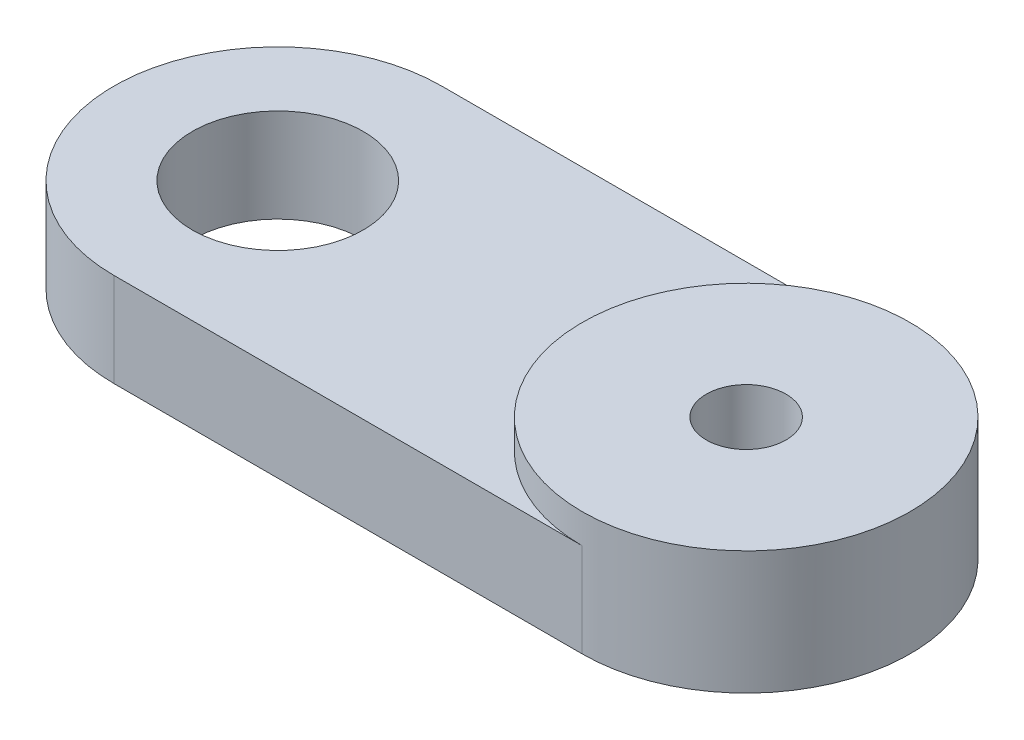
ISO-10303-21;
HEADER;
FILE_DESCRIPTION(('STEP AP214'),'2;1');
FILE_NAME('part.step','',(''),(''),'','','');
FILE_SCHEMA(('AUTOMOTIVE_DESIGN { 1 0 10303 214 1 1 1 1 }'));
ENDSEC;
DATA;
#1=APPLICATION_CONTEXT('core data for automotive mechanical design processes');
#2=APPLICATION_PROTOCOL_DEFINITION('international standard','automotive_design',2000,#1);
#3=PRODUCT_CONTEXT('',#1,'mechanical');
#4=PRODUCT('Part','Part','',(#3));
#5=PRODUCT_RELATED_PRODUCT_CATEGORY('part','',(#4));
#6=PRODUCT_DEFINITION_FORMATION('','',#4);
#7=PRODUCT_DEFINITION_CONTEXT('part definition',#1,'design');
#8=PRODUCT_DEFINITION('design','',#6,#7);
#9=PRODUCT_DEFINITION_SHAPE('','',#8);
#10=(LENGTH_UNIT() NAMED_UNIT(*) SI_UNIT(.MILLI.,.METRE.));
#11=(NAMED_UNIT(*) PLANE_ANGLE_UNIT() SI_UNIT($,.RADIAN.));
#12=(NAMED_UNIT(*) SI_UNIT($,.STERADIAN.) SOLID_ANGLE_UNIT());
#13=UNCERTAINTY_MEASURE_WITH_UNIT(LENGTH_MEASURE(1.E-05),#10,'distance_accuracy_value','');
#14=(GEOMETRIC_REPRESENTATION_CONTEXT(3) GLOBAL_UNCERTAINTY_ASSIGNED_CONTEXT((#13)) GLOBAL_UNIT_ASSIGNED_CONTEXT((#10,
#11,#12)) REPRESENTATION_CONTEXT('',''));
#15=CARTESIAN_POINT('',(0.,0.,0.));
#16=DIRECTION('',(0.,0.,1.));
#17=DIRECTION('',(1.,0.,0.));
#18=AXIS2_PLACEMENT_3D('',#15,#16,#17);
#19=CARTESIAN_POINT('',(12.7,2.54,0.));
#20=DIRECTION('',(0.,-1.,0.));
#21=DIRECTION('',(0.,0.,-1.));
#22=AXIS2_PLACEMENT_3D('',#19,#20,#21);
#23=CYLINDRICAL_SURFACE('',#22,4.445);
#24=CARTESIAN_POINT('',(12.7,0.,0.));
#25=DIRECTION('',(0.,1.,0.));
#26=DIRECTION('',(0.,0.,1.));
#27=AXIS2_PLACEMENT_3D('',#24,#25,#26);
#28=CIRCLE('',#27,4.445);
#29=CARTESIAN_POINT('',(12.7,0.,4.445));
#30=VERTEX_POINT('',#29);
#31=CARTESIAN_POINT('',(12.7,0.,-4.445));
#32=VERTEX_POINT('',#31);
#33=EDGE_CURVE('E97',#30,#32,#28,.T.);
#34=ORIENTED_EDGE('',*,*,#33,.T.);
#35=DIRECTION('',(0.,-1.,0.));
#36=VECTOR('',#35,1.);
#37=CARTESIAN_POINT('',(12.7,2.54,-4.445));
#38=LINE('',#37,#36);
#39=CARTESIAN_POINT('',(12.7,2.54,-4.445));
#40=VERTEX_POINT('',#39);
#41=EDGE_CURVE('E40',#40,#32,#38,.T.);
#42=ORIENTED_EDGE('',*,*,#41,.F.);
#43=CARTESIAN_POINT('',(12.7,2.54,0.));
#44=DIRECTION('',(0.,1.,0.));
#45=DIRECTION('',(0.,0.,1.));
#46=AXIS2_PLACEMENT_3D('',#43,#44,#45);
#47=CIRCLE('',#46,4.445);
#48=CARTESIAN_POINT('',(12.7,2.54,4.445));
#49=VERTEX_POINT('',#48);
#50=EDGE_CURVE('E12',#40,#49,#47,.T.);
#51=ORIENTED_EDGE('',*,*,#50,.T.);
#52=DIRECTION('',(0.,-1.,0.));
#53=VECTOR('',#52,1.);
#54=CARTESIAN_POINT('',(12.7,2.54,4.445));
#55=LINE('',#54,#53);
#56=EDGE_CURVE('E83',#49,#30,#55,.T.);
#57=ORIENTED_EDGE('',*,*,#56,.T.);
#58=EDGE_LOOP('',(#34,#42,#51,#57));
#59=FACE_BOUND('',#58,.T.);
#60=CARTESIAN_POINT('',(12.7,3.34,0.));
#61=DIRECTION('',(0.,1.,0.));
#62=DIRECTION('',(0.,0.,1.));
#63=AXIS2_PLACEMENT_3D('',#60,#61,#62);
#64=CIRCLE('',#63,4.445);
#65=CARTESIAN_POINT('',(12.7,3.34,4.445));
#66=VERTEX_POINT('',#65);
#67=EDGE_CURVE('E115',#66,#66,#64,.T.);
#68=ORIENTED_EDGE('',*,*,#67,.F.);
#69=EDGE_LOOP('',(#68));
#70=FACE_BOUND('',#69,.T.);
#71=ADVANCED_FACE('F37',(#59,#70),#23,.T.);
#72=CARTESIAN_POINT('',(0.,2.54,-4.445));
#73=DIRECTION('',(0.,0.,-1.));
#74=DIRECTION('',(-1.,0.,0.));
#75=AXIS2_PLACEMENT_3D('',#72,#73,#74);
#76=PLANE('',#75);
#77=DIRECTION('',(1.,0.,0.));
#78=VECTOR('',#77,1.);
#79=CARTESIAN_POINT('',(0.,0.,-4.445));
#80=LINE('',#79,#78);
#81=CARTESIAN_POINT('',(0.,0.,-4.445));
#82=VERTEX_POINT('',#81);
#83=EDGE_CURVE('E114',#82,#32,#80,.T.);
#84=ORIENTED_EDGE('',*,*,#83,.F.);
#85=DIRECTION('',(0.,-1.,0.));
#86=VECTOR('',#85,1.);
#87=CARTESIAN_POINT('',(0.,2.54,-4.445));
#88=LINE('',#87,#86);
#89=CARTESIAN_POINT('',(0.,2.54,-4.445));
#90=VERTEX_POINT('',#89);
#91=EDGE_CURVE('E101',#90,#82,#88,.T.);
#92=ORIENTED_EDGE('',*,*,#91,.F.);
#93=DIRECTION('',(1.,0.,0.));
#94=VECTOR('',#93,1.);
#95=CARTESIAN_POINT('',(0.,2.54,-4.445));
#96=LINE('',#95,#94);
#97=EDGE_CURVE('E102',#90,#40,#96,.T.);
#98=ORIENTED_EDGE('',*,*,#97,.T.);
#99=ORIENTED_EDGE('',*,*,#41,.T.);
#100=EDGE_LOOP('',(#84,#92,#98,#99));
#101=FACE_BOUND('',#100,.T.);
#102=ADVANCED_FACE('F103',(#101),#76,.T.);
#103=CARTESIAN_POINT('',(0.,2.54,0.));
#104=DIRECTION('',(0.,-1.,0.));
#105=DIRECTION('',(0.,0.,-1.));
#106=AXIS2_PLACEMENT_3D('',#103,#104,#105);
#107=CYLINDRICAL_SURFACE('',#106,4.445);
#108=CARTESIAN_POINT('',(0.,0.,0.));
#109=DIRECTION('',(0.,1.,0.));
#110=DIRECTION('',(0.,0.,1.));
#111=AXIS2_PLACEMENT_3D('',#108,#109,#110);
#112=CIRCLE('',#111,4.445);
#113=CARTESIAN_POINT('',(0.,0.,4.445));
#114=VERTEX_POINT('',#113);
#115=EDGE_CURVE('E71',#82,#114,#112,.T.);
#116=ORIENTED_EDGE('',*,*,#115,.T.);
#117=DIRECTION('',(0.,-1.,0.));
#118=VECTOR('',#117,1.);
#119=CARTESIAN_POINT('',(0.,2.54,4.445));
#120=LINE('',#119,#118);
#121=CARTESIAN_POINT('',(0.,2.54,4.445));
#122=VERTEX_POINT('',#121);
#123=EDGE_CURVE('E89',#122,#114,#120,.T.);
#124=ORIENTED_EDGE('',*,*,#123,.F.);
#125=CARTESIAN_POINT('',(0.,2.54,0.));
#126=DIRECTION('',(0.,1.,0.));
#127=DIRECTION('',(0.,0.,1.));
#128=AXIS2_PLACEMENT_3D('',#125,#126,#127);
#129=CIRCLE('',#128,4.445);
#130=EDGE_CURVE('E54',#90,#122,#129,.T.);
#131=ORIENTED_EDGE('',*,*,#130,.F.);
#132=ORIENTED_EDGE('',*,*,#91,.T.);
#133=EDGE_LOOP('',(#116,#124,#131,#132));
#134=FACE_BOUND('',#133,.T.);
#135=ADVANCED_FACE('F119',(#134),#107,.T.);
#136=CARTESIAN_POINT('',(0.,2.54,0.));
#137=DIRECTION('',(0.,-1.,0.));
#138=DIRECTION('',(0.,0.,-1.));
#139=AXIS2_PLACEMENT_3D('',#136,#137,#138);
#140=CYLINDRICAL_SURFACE('',#139,2.31775);
#141=CARTESIAN_POINT('',(0.,2.54,0.));
#142=DIRECTION('',(0.,1.,0.));
#143=DIRECTION('',(0.,0.,1.));
#144=AXIS2_PLACEMENT_3D('',#141,#142,#143);
#145=CIRCLE('',#144,2.31775);
#146=CARTESIAN_POINT('',(0.,2.54,2.31775));
#147=VERTEX_POINT('',#146);
#148=EDGE_CURVE('E90',#147,#147,#145,.T.);
#149=ORIENTED_EDGE('',*,*,#148,.T.);
#150=EDGE_LOOP('',(#149));
#151=FACE_BOUND('',#150,.T.);
#152=CARTESIAN_POINT('',(0.,0.,0.));
#153=DIRECTION('',(0.,1.,0.));
#154=DIRECTION('',(0.,0.,1.));
#155=AXIS2_PLACEMENT_3D('',#152,#153,#154);
#156=CIRCLE('',#155,2.31775);
#157=CARTESIAN_POINT('',(0.,0.,2.31775));
#158=VERTEX_POINT('',#157);
#159=EDGE_CURVE('E104',#158,#158,#156,.T.);
#160=ORIENTED_EDGE('',*,*,#159,.F.);
#161=EDGE_LOOP('',(#160));
#162=FACE_BOUND('',#161,.T.);
#163=ADVANCED_FACE('F129',(#151,#162),#140,.F.);
#164=CARTESIAN_POINT('',(0.,2.54,4.445));
#165=DIRECTION('',(0.,0.,-1.));
#166=DIRECTION('',(-1.,0.,0.));
#167=AXIS2_PLACEMENT_3D('',#164,#165,#166);
#168=PLANE('',#167);
#169=DIRECTION('',(1.,0.,0.));
#170=VECTOR('',#169,1.);
#171=CARTESIAN_POINT('',(0.,0.,4.445));
#172=LINE('',#171,#170);
#173=EDGE_CURVE('E77',#114,#30,#172,.T.);
#174=ORIENTED_EDGE('',*,*,#173,.T.);
#175=ORIENTED_EDGE('',*,*,#56,.F.);
#176=DIRECTION('',(1.,0.,0.));
#177=VECTOR('',#176,1.);
#178=CARTESIAN_POINT('',(0.,2.54,4.445));
#179=LINE('',#178,#177);
#180=EDGE_CURVE('E85',#122,#49,#179,.T.);
#181=ORIENTED_EDGE('',*,*,#180,.F.);
#182=ORIENTED_EDGE('',*,*,#123,.T.);
#183=EDGE_LOOP('',(#174,#175,#181,#182));
#184=FACE_BOUND('',#183,.T.);
#185=ADVANCED_FACE('F84',(#184),#168,.F.);
#186=CARTESIAN_POINT('',(12.7,2.54,0.));
#187=DIRECTION('',(0.,-1.,0.));
#188=DIRECTION('',(0.,0.,-1.));
#189=AXIS2_PLACEMENT_3D('',#186,#187,#188);
#190=CYLINDRICAL_SURFACE('',#189,1.0795);
#191=CARTESIAN_POINT('',(12.7,1.816,0.));
#192=DIRECTION('',(0.,1.,0.));
#193=DIRECTION('',(0.,0.,1.));
#194=AXIS2_PLACEMENT_3D('',#191,#192,#193);
#195=CIRCLE('',#194,1.0795);
#196=CARTESIAN_POINT('',(12.7,1.816,1.0795));
#197=VERTEX_POINT('',#196);
#198=EDGE_CURVE('E250',#197,#197,#195,.F.);
#199=ORIENTED_EDGE('',*,*,#198,.T.);
#200=EDGE_LOOP('',(#199));
#201=FACE_BOUND('',#200,.T.);
#202=CARTESIAN_POINT('',(12.7,3.34,0.));
#203=DIRECTION('',(0.,1.,0.));
#204=DIRECTION('',(0.,0.,1.));
#205=AXIS2_PLACEMENT_3D('',#202,#203,#204);
#206=CIRCLE('',#205,1.0795);
#207=CARTESIAN_POINT('',(12.7,3.34,1.0795));
#208=VERTEX_POINT('',#207);
#209=EDGE_CURVE('E251',#208,#208,#206,.T.);
#210=ORIENTED_EDGE('',*,*,#209,.T.);
#211=EDGE_LOOP('',(#210));
#212=FACE_BOUND('',#211,.T.);
#213=ADVANCED_FACE('F137',(#201,#212),#190,.F.);
#214=CARTESIAN_POINT('',(0.,2.54,0.));
#215=DIRECTION('',(0.,1.,0.));
#216=DIRECTION('',(0.,0.,1.));
#217=AXIS2_PLACEMENT_3D('',#214,#215,#216);
#218=PLANE('',#217);
#219=ORIENTED_EDGE('',*,*,#50,.F.);
#220=ORIENTED_EDGE('',*,*,#97,.F.);
#221=ORIENTED_EDGE('',*,*,#130,.T.);
#222=ORIENTED_EDGE('',*,*,#180,.T.);
#223=EDGE_LOOP('',(#219,#220,#221,#222));
#224=FACE_BOUND('',#223,.T.);
#225=ORIENTED_EDGE('',*,*,#148,.F.);
#226=EDGE_LOOP('',(#225));
#227=FACE_BOUND('',#226,.T.);
#228=ADVANCED_FACE('F92',(#224,#227),#218,.T.);
#229=CARTESIAN_POINT('',(0.,0.,0.));
#230=DIRECTION('',(0.,1.,0.));
#231=DIRECTION('',(0.,0.,1.));
#232=AXIS2_PLACEMENT_3D('',#229,#230,#231);
#233=PLANE('',#232);
#234=CARTESIAN_POINT('',(12.7,0.,0.));
#235=DIRECTION('',(0.,-1.,0.));
#236=DIRECTION('',(0.,0.,-1.));
#237=AXIS2_PLACEMENT_3D('',#234,#235,#236);
#238=CIRCLE('',#237,2.794);
#239=CARTESIAN_POINT('',(12.7,0.,-2.794));
#240=VERTEX_POINT('',#239);
#241=EDGE_CURVE('E252',#240,#240,#238,.T.);
#242=ORIENTED_EDGE('',*,*,#241,.F.);
#243=EDGE_LOOP('',(#242));
#244=FACE_BOUND('',#243,.T.);
#245=ORIENTED_EDGE('',*,*,#33,.F.);
#246=ORIENTED_EDGE('',*,*,#173,.F.);
#247=ORIENTED_EDGE('',*,*,#115,.F.);
#248=ORIENTED_EDGE('',*,*,#83,.T.);
#249=EDGE_LOOP('',(#245,#246,#247,#248));
#250=FACE_BOUND('',#249,.T.);
#251=ORIENTED_EDGE('',*,*,#159,.T.);
#252=EDGE_LOOP('',(#251));
#253=FACE_BOUND('',#252,.T.);
#254=ADVANCED_FACE('F121',(#244,#250,#253),#233,.F.);
#255=CARTESIAN_POINT('',(12.7,3.34,0.));
#256=DIRECTION('',(0.,1.,0.));
#257=DIRECTION('',(0.,0.,1.));
#258=AXIS2_PLACEMENT_3D('',#255,#256,#257);
#259=PLANE('',#258);
#260=ORIENTED_EDGE('',*,*,#67,.T.);
#261=EDGE_LOOP('',(#260));
#262=FACE_BOUND('',#261,.T.);
#263=ORIENTED_EDGE('',*,*,#209,.F.);
#264=EDGE_LOOP('',(#263));
#265=FACE_BOUND('',#264,.T.);
#266=ADVANCED_FACE('F124',(#262,#265),#259,.T.);
#267=CARTESIAN_POINT('',(12.7,11.2426253865409,0.));
#268=DIRECTION('',(0.,-1.,0.));
#269=DIRECTION('',(0.,0.,-1.));
#270=AXIS2_PLACEMENT_3D('',#267,#268,#269);
#271=CYLINDRICAL_SURFACE('',#270,2.794);
#272=ORIENTED_EDGE('',*,*,#241,.T.);
#273=EDGE_LOOP('',(#272));
#274=FACE_BOUND('',#273,.T.);
#275=CARTESIAN_POINT('',(12.7,1.816,0.));
#276=DIRECTION('',(0.,1.,0.));
#277=DIRECTION('',(0.,0.,1.));
#278=AXIS2_PLACEMENT_3D('',#275,#276,#277);
#279=CIRCLE('',#278,2.794);
#280=CARTESIAN_POINT('',(12.7,1.816,2.794));
#281=VERTEX_POINT('',#280);
#282=EDGE_CURVE('E247',#281,#281,#279,.F.);
#283=ORIENTED_EDGE('',*,*,#282,.F.);
#284=EDGE_LOOP('',(#283));
#285=FACE_BOUND('',#284,.T.);
#286=ADVANCED_FACE('F195',(#274,#285),#271,.F.);
#287=CARTESIAN_POINT('',(12.7,1.816,0.));
#288=DIRECTION('',(0.,1.,0.));
#289=DIRECTION('',(0.,0.,1.));
#290=AXIS2_PLACEMENT_3D('',#287,#288,#289);
#291=PLANE('',#290);
#292=ORIENTED_EDGE('',*,*,#282,.T.);
#293=EDGE_LOOP('',(#292));
#294=FACE_BOUND('',#293,.T.);
#295=ORIENTED_EDGE('',*,*,#198,.F.);
#296=EDGE_LOOP('',(#295));
#297=FACE_BOUND('',#296,.T.);
#298=ADVANCED_FACE('F204',(#294,#297),#291,.F.);
#299=CLOSED_SHELL('',(#71,#102,#135,#163,#185,#213,#228,#254,#266,#286,#298));
#300=MANIFOLD_SOLID_BREP('B2',#299);
#301=ADVANCED_BREP_SHAPE_REPRESENTATION('',(#18,#300),#14);
#302=SHAPE_DEFINITION_REPRESENTATION(#9,#301);
ENDSEC;
END-ISO-10303-21;
